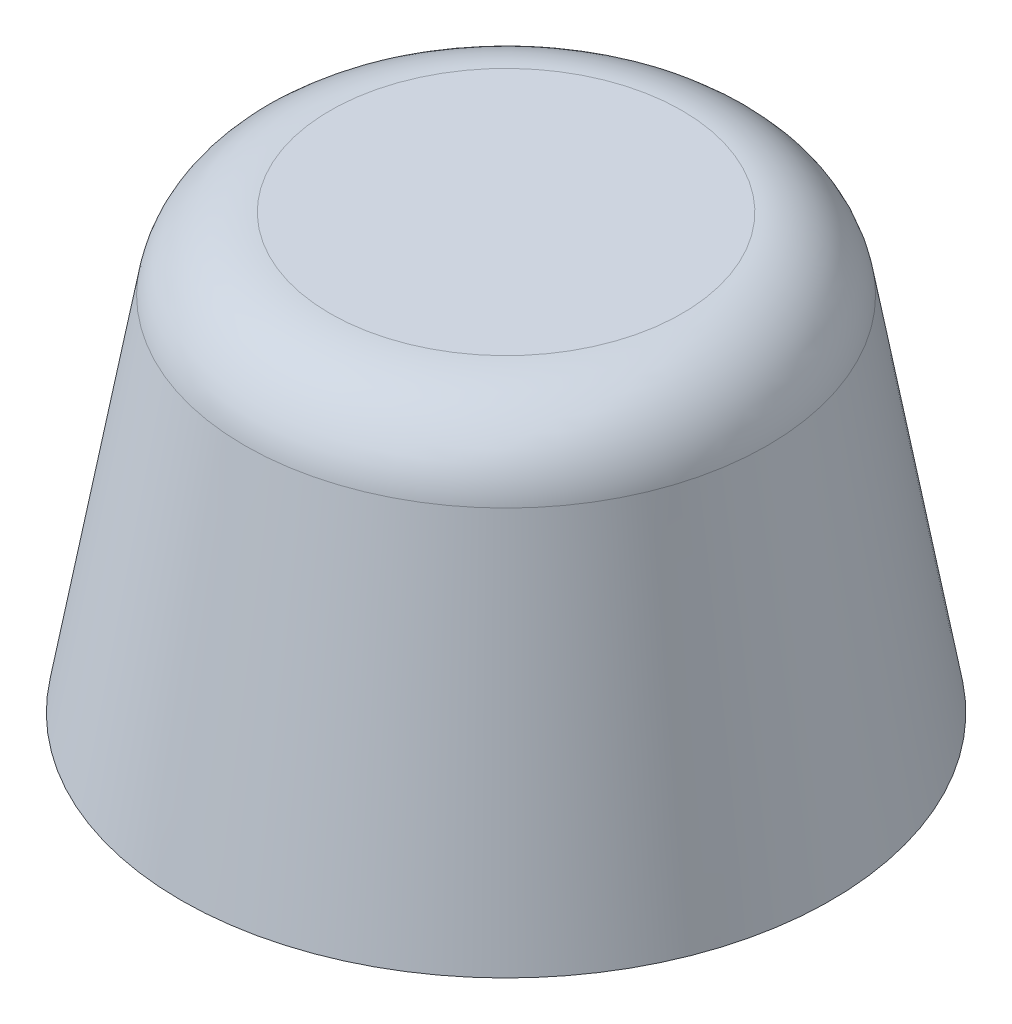
ISO-10303-21;
HEADER;
FILE_DESCRIPTION(('STEP AP214'),'2;1');
FILE_NAME('part.step','',(''),(''),'','','');
FILE_SCHEMA(('AUTOMOTIVE_DESIGN { 1 0 10303 214 1 1 1 1 }'));
ENDSEC;
DATA;
#1=APPLICATION_CONTEXT('core data for automotive mechanical design processes');
#2=APPLICATION_PROTOCOL_DEFINITION('international standard','automotive_design',2000,#1);
#3=PRODUCT_CONTEXT('',#1,'mechanical');
#4=PRODUCT('Part','Part','',(#3));
#5=PRODUCT_RELATED_PRODUCT_CATEGORY('part','',(#4));
#6=PRODUCT_DEFINITION_FORMATION('','',#4);
#7=PRODUCT_DEFINITION_CONTEXT('part definition',#1,'design');
#8=PRODUCT_DEFINITION('design','',#6,#7);
#9=PRODUCT_DEFINITION_SHAPE('','',#8);
#10=(LENGTH_UNIT() NAMED_UNIT(*) SI_UNIT(.MILLI.,.METRE.));
#11=(NAMED_UNIT(*) PLANE_ANGLE_UNIT() SI_UNIT($,.RADIAN.));
#12=(NAMED_UNIT(*) SI_UNIT($,.STERADIAN.) SOLID_ANGLE_UNIT());
#13=UNCERTAINTY_MEASURE_WITH_UNIT(LENGTH_MEASURE(1.E-05),#10,'distance_accuracy_value','');
#14=(GEOMETRIC_REPRESENTATION_CONTEXT(3) GLOBAL_UNCERTAINTY_ASSIGNED_CONTEXT((#13)) GLOBAL_UNIT_ASSIGNED_CONTEXT((#10,
#11,#12)) REPRESENTATION_CONTEXT('',''));
#15=CARTESIAN_POINT('',(0.,0.,0.));
#16=DIRECTION('',(0.,0.,1.));
#17=DIRECTION('',(1.,0.,0.));
#18=AXIS2_PLACEMENT_3D('',#15,#16,#17);
#19=CARTESIAN_POINT('',(0.,2.25,0.));
#20=DIRECTION('',(0.,-1.,0.));
#21=DIRECTION('',(0.,0.,-1.));
#22=AXIS2_PLACEMENT_3D('',#19,#20,#21);
#23=PLANE('',#22);
#24=CARTESIAN_POINT('',(0.,2.25,0.));
#25=DIRECTION('',(0.,-1.,0.));
#26=DIRECTION('',(0.,0.,-1.));
#27=AXIS2_PLACEMENT_3D('',#24,#25,#26);
#28=CIRCLE('',#27,5.625);
#29=CARTESIAN_POINT('',(0.,2.25,-5.625));
#30=VERTEX_POINT('',#29);
#31=EDGE_CURVE('E55',#30,#30,#28,.T.);
#32=ORIENTED_EDGE('',*,*,#31,.T.);
#33=EDGE_LOOP('',(#32));
#34=FACE_BOUND('',#33,.T.);
#35=CARTESIAN_POINT('',(0.,2.25,0.));
#36=DIRECTION('',(0.,-1.,0.));
#37=DIRECTION('',(0.,0.,-1.));
#38=AXIS2_PLACEMENT_3D('',#35,#36,#37);
#39=CIRCLE('',#38,5.58012437557734);
#40=CARTESIAN_POINT('',(0.,2.25,-5.58012437557734));
#41=VERTEX_POINT('',#40);
#42=EDGE_CURVE('E62',#41,#41,#39,.F.);
#43=ORIENTED_EDGE('',*,*,#42,.T.);
#44=EDGE_LOOP('',(#43));
#45=FACE_BOUND('',#44,.T.);
#46=ADVANCED_FACE('F37',(#34,#45),#23,.T.);
#47=CARTESIAN_POINT('',(0.,0.,0.));
#48=DIRECTION('',(0.,-1.,0.));
#49=DIRECTION('',(0.,0.,1.));
#50=AXIS2_PLACEMENT_3D('',#47,#48,#49);
#51=CONICAL_SURFACE('',#50,7.5,0.174532925199433);
#52=CARTESIAN_POINT('',(0.,8.34729635533386,0.));
#53=DIRECTION('',(0.,-1.,0.));
#54=DIRECTION('',(0.,0.,-1.));
#55=AXIS2_PLACEMENT_3D('',#52,#53,#54);
#56=CIRCLE('',#55,6.0281464365852);
#57=CARTESIAN_POINT('',(0.,8.34729635533386,-6.0281464365852));
#58=VERTEX_POINT('',#57);
#59=EDGE_CURVE('E10',#58,#58,#56,.T.);
#60=ORIENTED_EDGE('',*,*,#59,.T.);
#61=EDGE_LOOP('',(#60));
#62=FACE_BOUND('',#61,.T.);
#63=CARTESIAN_POINT('',(0.,0.,0.));
#64=DIRECTION('',(0.,1.,0.));
#65=DIRECTION('',(0.,0.,1.));
#66=AXIS2_PLACEMENT_3D('',#63,#64,#65);
#67=CIRCLE('',#66,7.5);
#68=CARTESIAN_POINT('',(0.,0.,7.5));
#69=VERTEX_POINT('',#68);
#70=EDGE_CURVE('E50',#69,#69,#67,.T.);
#71=ORIENTED_EDGE('',*,*,#70,.T.);
#72=EDGE_LOOP('',(#71));
#73=FACE_BOUND('',#72,.T.);
#74=ADVANCED_FACE('F86',(#62,#73),#51,.T.);
#75=CARTESIAN_POINT('',(0.,10.,0.));
#76=DIRECTION('',(0.,1.,0.));
#77=DIRECTION('',(0.,0.,1.));
#78=AXIS2_PLACEMENT_3D('',#75,#76,#77);
#79=PLANE('',#78);
#80=CARTESIAN_POINT('',(0.,10.,0.));
#81=DIRECTION('',(0.,1.,0.));
#82=DIRECTION('',(0.,0.,1.));
#83=AXIS2_PLACEMENT_3D('',#80,#81,#82);
#84=CIRCLE('',#83,4.05853093056079);
#85=CARTESIAN_POINT('',(0.,10.,4.05853093056079));
#86=VERTEX_POINT('',#85);
#87=EDGE_CURVE('E45',#86,#86,#84,.T.);
#88=ORIENTED_EDGE('',*,*,#87,.T.);
#89=EDGE_LOOP('',(#88));
#90=FACE_BOUND('',#89,.T.);
#91=ADVANCED_FACE('F92',(#90),#79,.T.);
#92=CARTESIAN_POINT('',(0.,0.,0.));
#93=DIRECTION('',(0.,1.,0.));
#94=DIRECTION('',(0.,0.,1.));
#95=AXIS2_PLACEMENT_3D('',#92,#93,#94);
#96=PLANE('',#95);
#97=CARTESIAN_POINT('',(0.,0.,0.));
#98=DIRECTION('',(0.,-1.,0.));
#99=DIRECTION('',(0.,0.,-1.));
#100=AXIS2_PLACEMENT_3D('',#97,#98,#99);
#101=CIRCLE('',#100,5.625);
#102=CARTESIAN_POINT('',(0.,0.,-5.625));
#103=VERTEX_POINT('',#102);
#104=EDGE_CURVE('E58',#103,#103,#101,.T.);
#105=ORIENTED_EDGE('',*,*,#104,.F.);
#106=EDGE_LOOP('',(#105));
#107=FACE_BOUND('',#106,.T.);
#108=ORIENTED_EDGE('',*,*,#70,.F.);
#109=EDGE_LOOP('',(#108));
#110=FACE_BOUND('',#109,.T.);
#111=ADVANCED_FACE('F99',(#107,#110),#96,.F.);
#112=CARTESIAN_POINT('',(0.,2.25,0.));
#113=DIRECTION('',(0.,-1.,0.));
#114=DIRECTION('',(0.,0.,-1.));
#115=AXIS2_PLACEMENT_3D('',#112,#113,#114);
#116=CYLINDRICAL_SURFACE('',#115,5.625);
#117=ORIENTED_EDGE('',*,*,#31,.F.);
#118=EDGE_LOOP('',(#117));
#119=FACE_BOUND('',#118,.T.);
#120=ORIENTED_EDGE('',*,*,#104,.T.);
#121=EDGE_LOOP('',(#120));
#122=FACE_BOUND('',#121,.T.);
#123=ADVANCED_FACE('F96',(#119,#122),#116,.F.);
#124=CARTESIAN_POINT('',(0.,8.,0.));
#125=DIRECTION('',(0.,1.,0.));
#126=DIRECTION('',(0.,0.,1.));
#127=AXIS2_PLACEMENT_3D('',#124,#125,#126);
#128=TOROIDAL_SURFACE('',#127,4.05853093056079,2.);
#129=ORIENTED_EDGE('',*,*,#59,.F.);
#130=EDGE_LOOP('',(#129));
#131=FACE_BOUND('',#130,.T.);
#132=ORIENTED_EDGE('',*,*,#87,.F.);
#133=EDGE_LOOP('',(#132));
#134=FACE_BOUND('',#133,.T.);
#135=ADVANCED_FACE('F39',(#131,#134),#128,.T.);
#136=CARTESIAN_POINT('',(0.,-0.260472266500396,0.));
#137=DIRECTION('',(0.,-1.,0.));
#138=DIRECTION('',(0.,0.,1.));
#139=AXIS2_PLACEMENT_3D('',#136,#137,#138);
#140=CONICAL_SURFACE('',#139,6.02278837048169,0.174532925199433);
#141=CARTESIAN_POINT('',(0.,8.08682408883347,0.));
#142=DIRECTION('',(0.,-1.,0.));
#143=DIRECTION('',(0.,0.,-1.));
#144=AXIS2_PLACEMENT_3D('',#141,#142,#143);
#145=CIRCLE('',#144,4.55093480706689);
#146=CARTESIAN_POINT('',(0.,8.08682408883347,-4.55093480706689));
#147=VERTEX_POINT('',#146);
#148=EDGE_CURVE('E68',#147,#147,#145,.T.);
#149=ORIENTED_EDGE('',*,*,#148,.F.);
#150=EDGE_LOOP('',(#149));
#151=FACE_BOUND('',#150,.T.);
#152=ORIENTED_EDGE('',*,*,#42,.F.);
#153=EDGE_LOOP('',(#152));
#154=FACE_BOUND('',#153,.T.);
#155=ADVANCED_FACE('F78',(#151,#154),#140,.F.);
#156=CARTESIAN_POINT('',(0.,8.5,0.));
#157=DIRECTION('',(0.,1.,0.));
#158=DIRECTION('',(0.,0.,1.));
#159=AXIS2_PLACEMENT_3D('',#156,#157,#158);
#160=PLANE('',#159);
#161=CARTESIAN_POINT('',(0.,8.5,0.));
#162=DIRECTION('',(0.,1.,0.));
#163=DIRECTION('',(0.,0.,1.));
#164=AXIS2_PLACEMENT_3D('',#161,#162,#163);
#165=CIRCLE('',#164,4.05853093056079);
#166=CARTESIAN_POINT('',(0.,8.5,4.05853093056079));
#167=VERTEX_POINT('',#166);
#168=EDGE_CURVE('E69',#167,#167,#165,.T.);
#169=ORIENTED_EDGE('',*,*,#168,.F.);
#170=EDGE_LOOP('',(#169));
#171=FACE_BOUND('',#170,.T.);
#172=ADVANCED_FACE('F81',(#171),#160,.F.);
#173=CARTESIAN_POINT('',(0.,8.,0.));
#174=DIRECTION('',(0.,1.,0.));
#175=DIRECTION('',(0.,0.,1.));
#176=AXIS2_PLACEMENT_3D('',#173,#174,#175);
#177=TOROIDAL_SURFACE('',#176,4.05853093056079,0.5);
#178=ORIENTED_EDGE('',*,*,#148,.T.);
#179=EDGE_LOOP('',(#178));
#180=FACE_BOUND('',#179,.T.);
#181=ORIENTED_EDGE('',*,*,#168,.T.);
#182=EDGE_LOOP('',(#181));
#183=FACE_BOUND('',#182,.T.);
#184=ADVANCED_FACE('F75',(#180,#183),#177,.F.);
#185=CLOSED_SHELL('',(#46,#74,#91,#111,#123,#135,#155,#172,#184));
#186=MANIFOLD_SOLID_BREP('B2',#185);
#187=ADVANCED_BREP_SHAPE_REPRESENTATION('',(#18,#186),#14);
#188=SHAPE_DEFINITION_REPRESENTATION(#9,#187);
ENDSEC;
END-ISO-10303-21;
